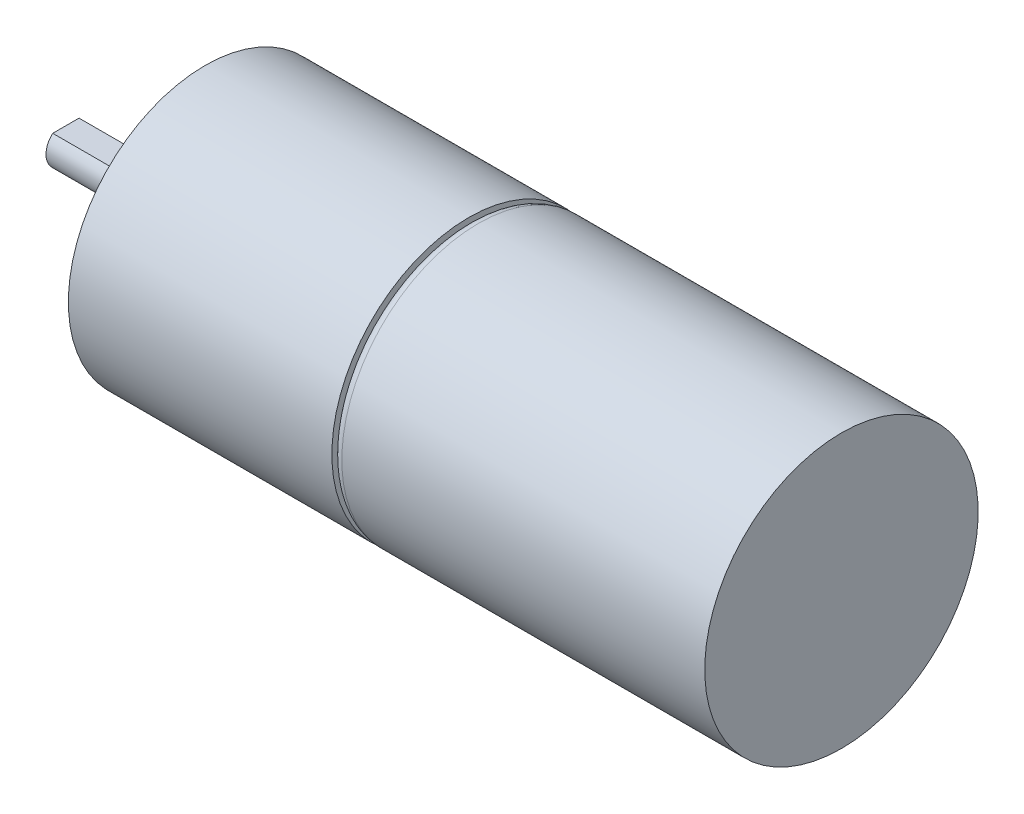
ISO-10303-21;
HEADER;
FILE_DESCRIPTION(('STEP AP214'),'2;1');
FILE_NAME('part.step','',(''),(''),'','','');
FILE_SCHEMA(('AUTOMOTIVE_DESIGN { 1 0 10303 214 1 1 1 1 }'));
ENDSEC;
DATA;
#1=APPLICATION_CONTEXT('core data for automotive mechanical design processes');
#2=APPLICATION_PROTOCOL_DEFINITION('international standard','automotive_design',2000,#1);
#3=PRODUCT_CONTEXT('',#1,'mechanical');
#4=PRODUCT('Part','Part','',(#3));
#5=PRODUCT_RELATED_PRODUCT_CATEGORY('part','',(#4));
#6=PRODUCT_DEFINITION_FORMATION('','',#4);
#7=PRODUCT_DEFINITION_CONTEXT('part definition',#1,'design');
#8=PRODUCT_DEFINITION('design','',#6,#7);
#9=PRODUCT_DEFINITION_SHAPE('','',#8);
#10=(LENGTH_UNIT() NAMED_UNIT(*) SI_UNIT(.MILLI.,.METRE.));
#11=(NAMED_UNIT(*) PLANE_ANGLE_UNIT() SI_UNIT($,.RADIAN.));
#12=(NAMED_UNIT(*) SI_UNIT($,.STERADIAN.) SOLID_ANGLE_UNIT());
#13=UNCERTAINTY_MEASURE_WITH_UNIT(LENGTH_MEASURE(1.E-05),#10,'distance_accuracy_value','');
#14=(GEOMETRIC_REPRESENTATION_CONTEXT(3) GLOBAL_UNCERTAINTY_ASSIGNED_CONTEXT((#13)) GLOBAL_UNIT_ASSIGNED_CONTEXT((#10,
#11,#12)) REPRESENTATION_CONTEXT('',''));
#15=CARTESIAN_POINT('',(0.,0.,0.));
#16=DIRECTION('',(0.,0.,1.));
#17=DIRECTION('',(1.,0.,0.));
#18=AXIS2_PLACEMENT_3D('',#15,#16,#17);
#19=CARTESIAN_POINT('',(0.,0.,0.));
#20=DIRECTION('',(-1.,0.,0.));
#21=DIRECTION('',(0.,-1.,0.));
#22=AXIS2_PLACEMENT_3D('',#19,#20,#21);
#23=PLANE('',#22);
#24=DIRECTION('',(0.,0.,1.));
#25=VECTOR('',#24,1.);
#26=CARTESIAN_POINT('',(0.,1.5,-1.3228756555323));
#27=LINE('',#26,#25);
#28=CARTESIAN_POINT('',(0.,1.5,-1.3228756555323));
#29=VERTEX_POINT('',#28);
#30=CARTESIAN_POINT('',(0.,1.5,1.3228756555323));
#31=VERTEX_POINT('',#30);
#32=EDGE_CURVE('E74',#29,#31,#27,.T.);
#33=ORIENTED_EDGE('',*,*,#32,.F.);
#34=CARTESIAN_POINT('',(0.,0.,0.));
#35=DIRECTION('',(1.,0.,0.));
#36=DIRECTION('',(0.,1.,0.));
#37=AXIS2_PLACEMENT_3D('',#34,#35,#36);
#38=CIRCLE('',#37,2.);
#39=EDGE_CURVE('E11',#31,#29,#38,.T.);
#40=ORIENTED_EDGE('',*,*,#39,.F.);
#41=EDGE_LOOP('',(#33,#40));
#42=FACE_BOUND('',#41,.T.);
#43=ADVANCED_FACE('F40',(#42),#23,.T.);
#44=CARTESIAN_POINT('',(78.,0.,0.));
#45=DIRECTION('',(1.,0.,0.));
#46=DIRECTION('',(0.,1.,0.));
#47=AXIS2_PLACEMENT_3D('',#44,#45,#46);
#48=CYLINDRICAL_SURFACE('',#47,2.);
#49=DIRECTION('',(-1.,0.,0.));
#50=VECTOR('',#49,1.);
#51=CARTESIAN_POINT('',(10.,1.5,-1.3228756555323));
#52=LINE('',#51,#50);
#53=CARTESIAN_POINT('',(10.,1.5,-1.3228756555323));
#54=VERTEX_POINT('',#53);
#55=EDGE_CURVE('E78',#54,#29,#52,.T.);
#56=ORIENTED_EDGE('',*,*,#55,.F.);
#57=CARTESIAN_POINT('',(10.,0.,0.));
#58=DIRECTION('',(-1.,0.,0.));
#59=DIRECTION('',(0.,1.,0.));
#60=AXIS2_PLACEMENT_3D('',#57,#58,#59);
#61=CIRCLE('',#60,2.);
#62=CARTESIAN_POINT('',(9.99999999999999,1.5,1.3228756555323));
#63=VERTEX_POINT('',#62);
#64=EDGE_CURVE('E69',#63,#54,#61,.T.);
#65=ORIENTED_EDGE('',*,*,#64,.F.);
#66=DIRECTION('',(-1.,0.,0.));
#67=VECTOR('',#66,1.);
#68=CARTESIAN_POINT('',(10.,1.5,1.3228756555323));
#69=LINE('',#68,#67);
#70=EDGE_CURVE('E80',#63,#31,#69,.T.);
#71=ORIENTED_EDGE('',*,*,#70,.T.);
#72=ORIENTED_EDGE('',*,*,#39,.T.);
#73=EDGE_LOOP('',(#56,#65,#71,#72));
#74=FACE_BOUND('',#73,.T.);
#75=CARTESIAN_POINT('',(12.,0.,0.));
#76=DIRECTION('',(1.,0.,0.));
#77=DIRECTION('',(0.,1.,0.));
#78=AXIS2_PLACEMENT_3D('',#75,#76,#77);
#79=CIRCLE('',#78,2.);
#80=CARTESIAN_POINT('',(12.,2.,0.));
#81=VERTEX_POINT('',#80);
#82=EDGE_CURVE('E47',#81,#81,#79,.T.);
#83=ORIENTED_EDGE('',*,*,#82,.F.);
#84=EDGE_LOOP('',(#83));
#85=FACE_BOUND('',#84,.T.);
#86=ADVANCED_FACE('F82',(#74,#85),#48,.T.);
#87=CARTESIAN_POINT('',(12.,2.,0.));
#88=DIRECTION('',(-1.,0.,0.));
#89=DIRECTION('',(0.,-1.,0.));
#90=AXIS2_PLACEMENT_3D('',#87,#88,#89);
#91=PLANE('',#90);
#92=ORIENTED_EDGE('',*,*,#82,.T.);
#93=EDGE_LOOP('',(#92));
#94=FACE_BOUND('',#93,.T.);
#95=CARTESIAN_POINT('',(12.,0.,0.));
#96=DIRECTION('',(1.,0.,0.));
#97=DIRECTION('',(0.,1.,0.));
#98=AXIS2_PLACEMENT_3D('',#95,#96,#97);
#99=CIRCLE('',#98,3.5);
#100=CARTESIAN_POINT('',(12.,3.5,0.));
#101=VERTEX_POINT('',#100);
#102=EDGE_CURVE('E119',#101,#101,#99,.T.);
#103=ORIENTED_EDGE('',*,*,#102,.F.);
#104=EDGE_LOOP('',(#103));
#105=FACE_BOUND('',#104,.T.);
#106=ADVANCED_FACE('F124',(#94,#105),#91,.T.);
#107=CARTESIAN_POINT('',(78.,0.,0.));
#108=DIRECTION('',(1.,0.,0.));
#109=DIRECTION('',(0.,1.,0.));
#110=AXIS2_PLACEMENT_3D('',#107,#108,#109);
#111=CYLINDRICAL_SURFACE('',#110,3.5);
#112=ORIENTED_EDGE('',*,*,#102,.T.);
#113=EDGE_LOOP('',(#112));
#114=FACE_BOUND('',#113,.T.);
#115=CARTESIAN_POINT('',(14.,0.,0.));
#116=DIRECTION('',(1.,0.,0.));
#117=DIRECTION('',(0.,1.,0.));
#118=AXIS2_PLACEMENT_3D('',#115,#116,#117);
#119=CIRCLE('',#118,3.5);
#120=CARTESIAN_POINT('',(14.,3.5,0.));
#121=VERTEX_POINT('',#120);
#122=EDGE_CURVE('E116',#121,#121,#119,.T.);
#123=ORIENTED_EDGE('',*,*,#122,.F.);
#124=EDGE_LOOP('',(#123));
#125=FACE_BOUND('',#124,.T.);
#126=ADVANCED_FACE('F131',(#114,#125),#111,.T.);
#127=CARTESIAN_POINT('',(14.,3.5,0.));
#128=DIRECTION('',(-1.,0.,0.));
#129=DIRECTION('',(0.,-1.,0.));
#130=AXIS2_PLACEMENT_3D('',#127,#128,#129);
#131=PLANE('',#130);
#132=CARTESIAN_POINT('',(14.,0.,-10.));
#133=DIRECTION('',(-1.,0.,0.));
#134=DIRECTION('',(0.,0.,1.));
#135=AXIS2_PLACEMENT_3D('',#132,#133,#134);
#136=CIRCLE('',#135,1.24999999999999);
#137=CARTESIAN_POINT('',(14.,0.,-8.75000000000001));
#138=VERTEX_POINT('',#137);
#139=EDGE_CURVE('E86',#138,#138,#136,.T.);
#140=ORIENTED_EDGE('',*,*,#139,.F.);
#141=EDGE_LOOP('',(#140));
#142=FACE_BOUND('',#141,.T.);
#143=CARTESIAN_POINT('',(14.,0.,10.));
#144=DIRECTION('',(-1.,0.,0.));
#145=DIRECTION('',(0.,0.,1.));
#146=AXIS2_PLACEMENT_3D('',#143,#144,#145);
#147=CIRCLE('',#146,1.24999999999999);
#148=CARTESIAN_POINT('',(14.,0.,11.25));
#149=VERTEX_POINT('',#148);
#150=EDGE_CURVE('E95',#149,#149,#147,.T.);
#151=ORIENTED_EDGE('',*,*,#150,.F.);
#152=EDGE_LOOP('',(#151));
#153=FACE_BOUND('',#152,.T.);
#154=ORIENTED_EDGE('',*,*,#122,.T.);
#155=EDGE_LOOP('',(#154));
#156=FACE_BOUND('',#155,.T.);
#157=CARTESIAN_POINT('',(14.,0.,0.));
#158=DIRECTION('',(1.,0.,0.));
#159=DIRECTION('',(0.,1.,0.));
#160=AXIS2_PLACEMENT_3D('',#157,#158,#159);
#161=CIRCLE('',#160,13.75);
#162=CARTESIAN_POINT('',(14.,13.75,0.));
#163=VERTEX_POINT('',#162);
#164=EDGE_CURVE('E113',#163,#163,#161,.T.);
#165=ORIENTED_EDGE('',*,*,#164,.F.);
#166=EDGE_LOOP('',(#165));
#167=FACE_BOUND('',#166,.T.);
#168=ADVANCED_FACE('F137',(#142,#153,#156,#167),#131,.T.);
#169=CARTESIAN_POINT('',(78.,0.,0.));
#170=DIRECTION('',(1.,0.,0.));
#171=DIRECTION('',(0.,1.,0.));
#172=AXIS2_PLACEMENT_3D('',#169,#170,#171);
#173=CYLINDRICAL_SURFACE('',#172,13.75);
#174=ORIENTED_EDGE('',*,*,#164,.T.);
#175=EDGE_LOOP('',(#174));
#176=FACE_BOUND('',#175,.T.);
#177=CARTESIAN_POINT('',(40.5,0.,0.));
#178=DIRECTION('',(1.,0.,0.));
#179=DIRECTION('',(0.,1.,0.));
#180=AXIS2_PLACEMENT_3D('',#177,#178,#179);
#181=CIRCLE('',#180,13.75);
#182=CARTESIAN_POINT('',(40.5,13.75,0.));
#183=VERTEX_POINT('',#182);
#184=EDGE_CURVE('E110',#183,#183,#181,.T.);
#185=ORIENTED_EDGE('',*,*,#184,.F.);
#186=EDGE_LOOP('',(#185));
#187=FACE_BOUND('',#186,.T.);
#188=ADVANCED_FACE('F141',(#176,#187),#173,.T.);
#189=CARTESIAN_POINT('',(40.5,13.75,0.));
#190=DIRECTION('',(1.,0.,0.));
#191=DIRECTION('',(0.,1.,0.));
#192=AXIS2_PLACEMENT_3D('',#189,#190,#191);
#193=PLANE('',#192);
#194=ORIENTED_EDGE('',*,*,#184,.T.);
#195=EDGE_LOOP('',(#194));
#196=FACE_BOUND('',#195,.T.);
#197=CARTESIAN_POINT('',(40.5,0.,0.));
#198=DIRECTION('',(1.,0.,0.));
#199=DIRECTION('',(0.,1.,0.));
#200=AXIS2_PLACEMENT_3D('',#197,#198,#199);
#201=CIRCLE('',#200,12.75);
#202=CARTESIAN_POINT('',(40.5,12.75,0.));
#203=VERTEX_POINT('',#202);
#204=EDGE_CURVE('E107',#203,#203,#201,.T.);
#205=ORIENTED_EDGE('',*,*,#204,.F.);
#206=EDGE_LOOP('',(#205));
#207=FACE_BOUND('',#206,.T.);
#208=ADVANCED_FACE('F145',(#196,#207),#193,.T.);
#209=CARTESIAN_POINT('',(41.5,0.,0.));
#210=DIRECTION('',(1.,0.,0.));
#211=DIRECTION('',(0.,1.,0.));
#212=AXIS2_PLACEMENT_3D('',#209,#210,#211);
#213=TOROIDAL_SURFACE('',#212,12.75,1.);
#214=ORIENTED_EDGE('',*,*,#204,.T.);
#215=EDGE_LOOP('',(#214));
#216=FACE_BOUND('',#215,.T.);
#217=CARTESIAN_POINT('',(41.5,0.,0.));
#218=DIRECTION('',(1.,0.,0.));
#219=DIRECTION('',(0.,1.,0.));
#220=AXIS2_PLACEMENT_3D('',#217,#218,#219);
#221=CIRCLE('',#220,13.75);
#222=CARTESIAN_POINT('',(41.5,13.75,0.));
#223=VERTEX_POINT('',#222);
#224=EDGE_CURVE('E104',#223,#223,#221,.T.);
#225=ORIENTED_EDGE('',*,*,#224,.F.);
#226=EDGE_LOOP('',(#225));
#227=FACE_BOUND('',#226,.T.);
#228=ADVANCED_FACE('F149',(#216,#227),#213,.T.);
#229=CARTESIAN_POINT('',(78.,0.,0.));
#230=DIRECTION('',(1.,0.,0.));
#231=DIRECTION('',(0.,1.,0.));
#232=AXIS2_PLACEMENT_3D('',#229,#230,#231);
#233=CYLINDRICAL_SURFACE('',#232,13.75);
#234=ORIENTED_EDGE('',*,*,#224,.T.);
#235=EDGE_LOOP('',(#234));
#236=FACE_BOUND('',#235,.T.);
#237=CARTESIAN_POINT('',(78.,0.,0.));
#238=DIRECTION('',(1.,0.,0.));
#239=DIRECTION('',(0.,1.,0.));
#240=AXIS2_PLACEMENT_3D('',#237,#238,#239);
#241=CIRCLE('',#240,13.75);
#242=CARTESIAN_POINT('',(78.,13.75,0.));
#243=VERTEX_POINT('',#242);
#244=EDGE_CURVE('E101',#243,#243,#241,.T.);
#245=ORIENTED_EDGE('',*,*,#244,.F.);
#246=EDGE_LOOP('',(#245));
#247=FACE_BOUND('',#246,.T.);
#248=ADVANCED_FACE('F153',(#236,#247),#233,.T.);
#249=CARTESIAN_POINT('',(78.,13.75,0.));
#250=DIRECTION('',(1.,0.,0.));
#251=DIRECTION('',(0.,1.,0.));
#252=AXIS2_PLACEMENT_3D('',#249,#250,#251);
#253=PLANE('',#252);
#254=ORIENTED_EDGE('',*,*,#244,.T.);
#255=EDGE_LOOP('',(#254));
#256=FACE_BOUND('',#255,.T.);
#257=ADVANCED_FACE('F157',(#256),#253,.T.);
#258=CARTESIAN_POINT('',(16.,0.,10.));
#259=DIRECTION('',(-1.,0.,0.));
#260=DIRECTION('',(0.,0.,1.));
#261=AXIS2_PLACEMENT_3D('',#258,#259,#260);
#262=CONICAL_SURFACE('',#261,1.25,1.02974425867665);
#263=CARTESIAN_POINT('',(16.7510757737845,0.,10.));
#264=VERTEX_POINT('',#263);
#265=VERTEX_LOOP('',#264);
#266=FACE_BOUND('',#265,.T.);
#267=CARTESIAN_POINT('',(16.,0.,10.));
#268=DIRECTION('',(-1.,0.,0.));
#269=DIRECTION('',(0.,0.,1.));
#270=AXIS2_PLACEMENT_3D('',#267,#268,#269);
#271=CIRCLE('',#270,1.25);
#272=CARTESIAN_POINT('',(16.,0.,11.25));
#273=VERTEX_POINT('',#272);
#274=EDGE_CURVE('E98',#273,#273,#271,.T.);
#275=ORIENTED_EDGE('',*,*,#274,.T.);
#276=EDGE_LOOP('',(#275));
#277=FACE_BOUND('',#276,.T.);
#278=ADVANCED_FACE('F161',(#266,#277),#262,.F.);
#279=CARTESIAN_POINT('',(14.,0.,10.));
#280=DIRECTION('',(-1.,0.,0.));
#281=DIRECTION('',(0.,0.,1.));
#282=AXIS2_PLACEMENT_3D('',#279,#280,#281);
#283=CYLINDRICAL_SURFACE('',#282,1.24999999999999);
#284=ORIENTED_EDGE('',*,*,#274,.F.);
#285=EDGE_LOOP('',(#284));
#286=FACE_BOUND('',#285,.T.);
#287=ORIENTED_EDGE('',*,*,#150,.T.);
#288=EDGE_LOOP('',(#287));
#289=FACE_BOUND('',#288,.T.);
#290=ADVANCED_FACE('F165',(#286,#289),#283,.F.);
#291=CARTESIAN_POINT('',(16.,0.,-10.));
#292=DIRECTION('',(-1.,0.,0.));
#293=DIRECTION('',(0.,0.,1.));
#294=AXIS2_PLACEMENT_3D('',#291,#292,#293);
#295=CONICAL_SURFACE('',#294,1.25,1.02974425867665);
#296=CARTESIAN_POINT('',(16.7510757737845,0.,-10.));
#297=VERTEX_POINT('',#296);
#298=VERTEX_LOOP('',#297);
#299=FACE_BOUND('',#298,.T.);
#300=CARTESIAN_POINT('',(16.,0.,-10.));
#301=DIRECTION('',(-1.,0.,0.));
#302=DIRECTION('',(0.,0.,1.));
#303=AXIS2_PLACEMENT_3D('',#300,#301,#302);
#304=CIRCLE('',#303,1.25);
#305=CARTESIAN_POINT('',(16.,0.,-8.75));
#306=VERTEX_POINT('',#305);
#307=EDGE_CURVE('E92',#306,#306,#304,.T.);
#308=ORIENTED_EDGE('',*,*,#307,.T.);
#309=EDGE_LOOP('',(#308));
#310=FACE_BOUND('',#309,.T.);
#311=ADVANCED_FACE('F168',(#299,#310),#295,.F.);
#312=CARTESIAN_POINT('',(14.,0.,-10.));
#313=DIRECTION('',(-1.,0.,0.));
#314=DIRECTION('',(0.,0.,1.));
#315=AXIS2_PLACEMENT_3D('',#312,#313,#314);
#316=CYLINDRICAL_SURFACE('',#315,1.24999999999999);
#317=ORIENTED_EDGE('',*,*,#307,.F.);
#318=EDGE_LOOP('',(#317));
#319=FACE_BOUND('',#318,.T.);
#320=ORIENTED_EDGE('',*,*,#139,.T.);
#321=EDGE_LOOP('',(#320));
#322=FACE_BOUND('',#321,.T.);
#323=ADVANCED_FACE('F172',(#319,#322),#316,.F.);
#324=CARTESIAN_POINT('',(10.,1.5,-1.3228756555323));
#325=DIRECTION('',(0.,-1.,0.));
#326=DIRECTION('',(1.,0.,0.));
#327=AXIS2_PLACEMENT_3D('',#324,#325,#326);
#328=PLANE('',#327);
#329=ORIENTED_EDGE('',*,*,#32,.T.);
#330=ORIENTED_EDGE('',*,*,#70,.F.);
#331=DIRECTION('',(0.,0.,1.));
#332=VECTOR('',#331,1.);
#333=CARTESIAN_POINT('',(10.,1.5,-1.3228756555323));
#334=LINE('',#333,#332);
#335=EDGE_CURVE('E53',#54,#63,#334,.T.);
#336=ORIENTED_EDGE('',*,*,#335,.F.);
#337=ORIENTED_EDGE('',*,*,#55,.T.);
#338=EDGE_LOOP('',(#329,#330,#336,#337));
#339=FACE_BOUND('',#338,.T.);
#340=ADVANCED_FACE('F77',(#339),#328,.F.);
#341=CARTESIAN_POINT('',(10.,0.,0.));
#342=DIRECTION('',(1.,0.,0.));
#343=DIRECTION('',(0.,1.,0.));
#344=AXIS2_PLACEMENT_3D('',#341,#342,#343);
#345=PLANE('',#344);
#346=ORIENTED_EDGE('',*,*,#64,.T.);
#347=ORIENTED_EDGE('',*,*,#335,.T.);
#348=EDGE_LOOP('',(#346,#347));
#349=FACE_BOUND('',#348,.T.);
#350=ADVANCED_FACE('F70',(#349),#345,.F.);
#351=CLOSED_SHELL('',(#43,#86,#106,#126,#168,#188,#208,#228,#248,#257,#278,#290,#311,#323,#340,#350));
#352=MANIFOLD_SOLID_BREP('B2',#351);
#353=ADVANCED_BREP_SHAPE_REPRESENTATION('',(#18,#352),#14);
#354=SHAPE_DEFINITION_REPRESENTATION(#9,#353);
ENDSEC;
END-ISO-10303-21;
